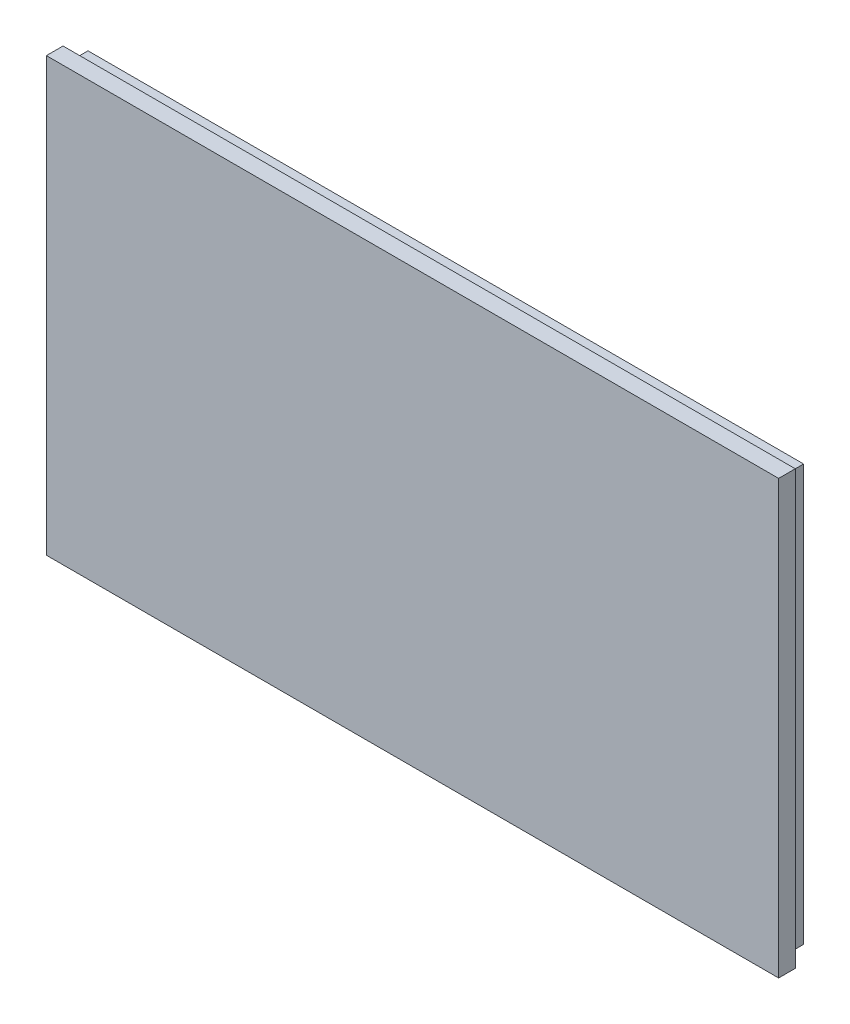
ISO-10303-21;
HEADER;
FILE_DESCRIPTION(('STEP AP214'),'2;1');
FILE_NAME('part.step','',(''),(''),'','','');
FILE_SCHEMA(('AUTOMOTIVE_DESIGN { 1 0 10303 214 1 1 1 1 }'));
ENDSEC;
DATA;
#1=APPLICATION_CONTEXT('core data for automotive mechanical design processes');
#2=APPLICATION_PROTOCOL_DEFINITION('international standard','automotive_design',2000,#1);
#3=PRODUCT_CONTEXT('',#1,'mechanical');
#4=PRODUCT('Part','Part','',(#3));
#5=PRODUCT_RELATED_PRODUCT_CATEGORY('part','',(#4));
#6=PRODUCT_DEFINITION_FORMATION('','',#4);
#7=PRODUCT_DEFINITION_CONTEXT('part definition',#1,'design');
#8=PRODUCT_DEFINITION('design','',#6,#7);
#9=PRODUCT_DEFINITION_SHAPE('','',#8);
#10=(LENGTH_UNIT() NAMED_UNIT(*) SI_UNIT(.MILLI.,.METRE.));
#11=(NAMED_UNIT(*) PLANE_ANGLE_UNIT() SI_UNIT($,.RADIAN.));
#12=(NAMED_UNIT(*) SI_UNIT($,.STERADIAN.) SOLID_ANGLE_UNIT());
#13=UNCERTAINTY_MEASURE_WITH_UNIT(LENGTH_MEASURE(1.E-05),#10,'distance_accuracy_value','');
#14=(GEOMETRIC_REPRESENTATION_CONTEXT(3) GLOBAL_UNCERTAINTY_ASSIGNED_CONTEXT((#13)) GLOBAL_UNIT_ASSIGNED_CONTEXT((#10,
#11,#12)) REPRESENTATION_CONTEXT('',''));
#15=CARTESIAN_POINT('',(0.,0.,0.));
#16=DIRECTION('',(0.,0.,1.));
#17=DIRECTION('',(1.,0.,0.));
#18=AXIS2_PLACEMENT_3D('',#15,#16,#17);
#19=CARTESIAN_POINT('',(22.,-13.,1.));
#20=DIRECTION('',(-1.,0.,0.));
#21=DIRECTION('',(0.,0.,1.));
#22=AXIS2_PLACEMENT_3D('',#19,#20,#21);
#23=PLANE('',#22);
#24=DIRECTION('',(0.,1.,0.));
#25=VECTOR('',#24,1.);
#26=CARTESIAN_POINT('',(22.,-13.,0.));
#27=LINE('',#26,#25);
#28=CARTESIAN_POINT('',(22.,-13.,0.));
#29=VERTEX_POINT('',#28);
#30=CARTESIAN_POINT('',(22.,13.,0.));
#31=VERTEX_POINT('',#30);
#32=EDGE_CURVE('E127',#29,#31,#27,.T.);
#33=ORIENTED_EDGE('',*,*,#32,.T.);
#34=DIRECTION('',(0.,0.,-1.));
#35=VECTOR('',#34,1.);
#36=CARTESIAN_POINT('',(22.,13.,1.));
#37=LINE('',#36,#35);
#38=CARTESIAN_POINT('',(22.,13.,1.));
#39=VERTEX_POINT('',#38);
#40=EDGE_CURVE('E11',#39,#31,#37,.T.);
#41=ORIENTED_EDGE('',*,*,#40,.F.);
#42=DIRECTION('',(0.,1.,0.));
#43=VECTOR('',#42,1.);
#44=CARTESIAN_POINT('',(22.,-13.,1.));
#45=LINE('',#44,#43);
#46=CARTESIAN_POINT('',(22.,-13.,1.));
#47=VERTEX_POINT('',#46);
#48=EDGE_CURVE('E138',#47,#39,#45,.T.);
#49=ORIENTED_EDGE('',*,*,#48,.F.);
#50=DIRECTION('',(0.,0.,-1.));
#51=VECTOR('',#50,1.);
#52=CARTESIAN_POINT('',(22.,-13.,1.));
#53=LINE('',#52,#51);
#54=EDGE_CURVE('E151',#47,#29,#53,.T.);
#55=ORIENTED_EDGE('',*,*,#54,.T.);
#56=EDGE_LOOP('',(#33,#41,#49,#55));
#57=FACE_BOUND('',#56,.T.);
#58=ADVANCED_FACE('F39',(#57),#23,.F.);
#59=CARTESIAN_POINT('',(-22.,13.,1.));
#60=DIRECTION('',(0.,-1.,0.));
#61=DIRECTION('',(0.,0.,-1.));
#62=AXIS2_PLACEMENT_3D('',#59,#60,#61);
#63=PLANE('',#62);
#64=DIRECTION('',(-1.,0.,0.));
#65=VECTOR('',#64,1.);
#66=CARTESIAN_POINT('',(-22.,13.,0.));
#67=LINE('',#66,#65);
#68=CARTESIAN_POINT('',(-22.,13.,0.));
#69=VERTEX_POINT('',#68);
#70=EDGE_CURVE('E132',#31,#69,#67,.T.);
#71=ORIENTED_EDGE('',*,*,#70,.T.);
#72=DIRECTION('',(0.,0.,-1.));
#73=VECTOR('',#72,1.);
#74=CARTESIAN_POINT('',(-22.,13.,1.));
#75=LINE('',#74,#73);
#76=CARTESIAN_POINT('',(-22.,13.,1.));
#77=VERTEX_POINT('',#76);
#78=EDGE_CURVE('E47',#77,#69,#75,.T.);
#79=ORIENTED_EDGE('',*,*,#78,.F.);
#80=DIRECTION('',(-1.,0.,0.));
#81=VECTOR('',#80,1.);
#82=CARTESIAN_POINT('',(-22.,13.,1.));
#83=LINE('',#82,#81);
#84=EDGE_CURVE('E142',#39,#77,#83,.T.);
#85=ORIENTED_EDGE('',*,*,#84,.F.);
#86=ORIENTED_EDGE('',*,*,#40,.T.);
#87=EDGE_LOOP('',(#71,#79,#85,#86));
#88=FACE_BOUND('',#87,.T.);
#89=ADVANCED_FACE('F188',(#88),#63,.F.);
#90=CARTESIAN_POINT('',(-22.,-13.,1.));
#91=DIRECTION('',(1.,0.,0.));
#92=DIRECTION('',(0.,0.,-1.));
#93=AXIS2_PLACEMENT_3D('',#90,#91,#92);
#94=PLANE('',#93);
#95=DIRECTION('',(0.,-1.,0.));
#96=VECTOR('',#95,1.);
#97=CARTESIAN_POINT('',(-22.,-13.,0.));
#98=LINE('',#97,#96);
#99=CARTESIAN_POINT('',(-22.,-13.,0.));
#100=VERTEX_POINT('',#99);
#101=EDGE_CURVE('E155',#69,#100,#98,.T.);
#102=ORIENTED_EDGE('',*,*,#101,.T.);
#103=DIRECTION('',(0.,0.,-1.));
#104=VECTOR('',#103,1.);
#105=CARTESIAN_POINT('',(-22.,-13.,1.));
#106=LINE('',#105,#104);
#107=CARTESIAN_POINT('',(-22.,-13.,1.));
#108=VERTEX_POINT('',#107);
#109=EDGE_CURVE('E163',#108,#100,#106,.T.);
#110=ORIENTED_EDGE('',*,*,#109,.F.);
#111=DIRECTION('',(0.,-1.,0.));
#112=VECTOR('',#111,1.);
#113=CARTESIAN_POINT('',(-22.,-13.,1.));
#114=LINE('',#113,#112);
#115=EDGE_CURVE('E146',#77,#108,#114,.T.);
#116=ORIENTED_EDGE('',*,*,#115,.F.);
#117=ORIENTED_EDGE('',*,*,#78,.T.);
#118=EDGE_LOOP('',(#102,#110,#116,#117));
#119=FACE_BOUND('',#118,.T.);
#120=ADVANCED_FACE('F172',(#119),#94,.F.);
#121=CARTESIAN_POINT('',(-22.,-13.,1.));
#122=DIRECTION('',(0.,1.,0.));
#123=DIRECTION('',(0.,0.,1.));
#124=AXIS2_PLACEMENT_3D('',#121,#122,#123);
#125=PLANE('',#124);
#126=DIRECTION('',(1.,0.,0.));
#127=VECTOR('',#126,1.);
#128=CARTESIAN_POINT('',(-22.,-13.,0.));
#129=LINE('',#128,#127);
#130=EDGE_CURVE('E143',#100,#29,#129,.T.);
#131=ORIENTED_EDGE('',*,*,#130,.T.);
#132=ORIENTED_EDGE('',*,*,#54,.F.);
#133=DIRECTION('',(1.,0.,0.));
#134=VECTOR('',#133,1.);
#135=CARTESIAN_POINT('',(-22.,-13.,1.));
#136=LINE('',#135,#134);
#137=EDGE_CURVE('E149',#108,#47,#136,.T.);
#138=ORIENTED_EDGE('',*,*,#137,.F.);
#139=ORIENTED_EDGE('',*,*,#109,.T.);
#140=EDGE_LOOP('',(#131,#132,#138,#139));
#141=FACE_BOUND('',#140,.T.);
#142=ADVANCED_FACE('F181',(#141),#125,.F.);
#143=CARTESIAN_POINT('',(0.,0.,1.));
#144=DIRECTION('',(0.,0.,-1.));
#145=DIRECTION('',(-1.,0.,0.));
#146=AXIS2_PLACEMENT_3D('',#143,#144,#145);
#147=PLANE('',#146);
#148=ORIENTED_EDGE('',*,*,#48,.T.);
#149=ORIENTED_EDGE('',*,*,#84,.T.);
#150=ORIENTED_EDGE('',*,*,#115,.T.);
#151=ORIENTED_EDGE('',*,*,#137,.T.);
#152=EDGE_LOOP('',(#148,#149,#150,#151));
#153=FACE_BOUND('',#152,.T.);
#154=ADVANCED_FACE('F187',(#153),#147,.F.);
#155=CARTESIAN_POINT('',(0.,0.,0.));
#156=DIRECTION('',(0.,0.,-1.));
#157=DIRECTION('',(-1.,0.,0.));
#158=AXIS2_PLACEMENT_3D('',#155,#156,#157);
#159=PLANE('',#158);
#160=DIRECTION('',(0.,1.,0.));
#161=VECTOR('',#160,1.);
#162=CARTESIAN_POINT('',(-21.5,-12.5,0.));
#163=LINE('',#162,#161);
#164=CARTESIAN_POINT('',(-21.5,-12.5,0.));
#165=VERTEX_POINT('',#164);
#166=CARTESIAN_POINT('',(-21.5,12.5,0.));
#167=VERTEX_POINT('',#166);
#168=EDGE_CURVE('E54',#165,#167,#163,.T.);
#169=ORIENTED_EDGE('',*,*,#168,.F.);
#170=DIRECTION('',(-1.,0.,0.));
#171=VECTOR('',#170,1.);
#172=CARTESIAN_POINT('',(21.5,-12.5,0.));
#173=LINE('',#172,#171);
#174=CARTESIAN_POINT('',(21.5,-12.5,0.));
#175=VERTEX_POINT('',#174);
#176=EDGE_CURVE('E58',#175,#165,#173,.T.);
#177=ORIENTED_EDGE('',*,*,#176,.F.);
#178=DIRECTION('',(0.,-1.,0.));
#179=VECTOR('',#178,1.);
#180=CARTESIAN_POINT('',(21.5,-12.5,0.));
#181=LINE('',#180,#179);
#182=CARTESIAN_POINT('',(21.5,12.5,0.));
#183=VERTEX_POINT('',#182);
#184=EDGE_CURVE('E283',#183,#175,#181,.T.);
#185=ORIENTED_EDGE('',*,*,#184,.F.);
#186=DIRECTION('',(1.,0.,0.));
#187=VECTOR('',#186,1.);
#188=CARTESIAN_POINT('',(21.5,12.5,0.));
#189=LINE('',#188,#187);
#190=EDGE_CURVE('E293',#167,#183,#189,.T.);
#191=ORIENTED_EDGE('',*,*,#190,.F.);
#192=EDGE_LOOP('',(#169,#177,#185,#191));
#193=FACE_BOUND('',#192,.T.);
#194=ORIENTED_EDGE('',*,*,#32,.F.);
#195=ORIENTED_EDGE('',*,*,#130,.F.);
#196=ORIENTED_EDGE('',*,*,#101,.F.);
#197=ORIENTED_EDGE('',*,*,#70,.F.);
#198=EDGE_LOOP('',(#194,#195,#196,#197));
#199=FACE_BOUND('',#198,.T.);
#200=ADVANCED_FACE('F178',(#193,#199),#159,.T.);
#201=CARTESIAN_POINT('',(-21.5,-12.5,-1.));
#202=DIRECTION('',(1.,0.,0.));
#203=DIRECTION('',(0.,0.,-1.));
#204=AXIS2_PLACEMENT_3D('',#201,#202,#203);
#205=PLANE('',#204);
#206=ORIENTED_EDGE('',*,*,#168,.T.);
#207=DIRECTION('',(0.,0.,1.));
#208=VECTOR('',#207,1.);
#209=CARTESIAN_POINT('',(-21.5,12.5,-1.));
#210=LINE('',#209,#208);
#211=CARTESIAN_POINT('',(-21.5,12.5,-1.));
#212=VERTEX_POINT('',#211);
#213=EDGE_CURVE('E107',#212,#167,#210,.T.);
#214=ORIENTED_EDGE('',*,*,#213,.F.);
#215=DIRECTION('',(0.,1.,0.));
#216=VECTOR('',#215,1.);
#217=CARTESIAN_POINT('',(-21.5,-12.5,-1.));
#218=LINE('',#217,#216);
#219=CARTESIAN_POINT('',(-21.5,-12.5,-1.));
#220=VERTEX_POINT('',#219);
#221=EDGE_CURVE('E114',#220,#212,#218,.T.);
#222=ORIENTED_EDGE('',*,*,#221,.F.);
#223=DIRECTION('',(0.,0.,1.));
#224=VECTOR('',#223,1.);
#225=CARTESIAN_POINT('',(-21.5,-12.5,-1.));
#226=LINE('',#225,#224);
#227=EDGE_CURVE('E280',#220,#165,#226,.T.);
#228=ORIENTED_EDGE('',*,*,#227,.T.);
#229=EDGE_LOOP('',(#206,#214,#222,#228));
#230=FACE_BOUND('',#229,.T.);
#231=ADVANCED_FACE('F125',(#230),#205,.F.);
#232=CARTESIAN_POINT('',(21.5,12.5,-1.));
#233=DIRECTION('',(0.,-1.,0.));
#234=DIRECTION('',(0.,0.,-1.));
#235=AXIS2_PLACEMENT_3D('',#232,#233,#234);
#236=PLANE('',#235);
#237=ORIENTED_EDGE('',*,*,#190,.T.);
#238=DIRECTION('',(0.,0.,1.));
#239=VECTOR('',#238,1.);
#240=CARTESIAN_POINT('',(21.5,12.5,-1.));
#241=LINE('',#240,#239);
#242=CARTESIAN_POINT('',(21.5,12.5,-1.));
#243=VERTEX_POINT('',#242);
#244=EDGE_CURVE('E109',#243,#183,#241,.T.);
#245=ORIENTED_EDGE('',*,*,#244,.F.);
#246=DIRECTION('',(1.,0.,0.));
#247=VECTOR('',#246,1.);
#248=CARTESIAN_POINT('',(21.5,12.5,-1.));
#249=LINE('',#248,#247);
#250=EDGE_CURVE('E102',#212,#243,#249,.T.);
#251=ORIENTED_EDGE('',*,*,#250,.F.);
#252=ORIENTED_EDGE('',*,*,#213,.T.);
#253=EDGE_LOOP('',(#237,#245,#251,#252));
#254=FACE_BOUND('',#253,.T.);
#255=ADVANCED_FACE('F105',(#254),#236,.F.);
#256=CARTESIAN_POINT('',(21.5,-12.5,-1.));
#257=DIRECTION('',(-1.,0.,0.));
#258=DIRECTION('',(0.,0.,1.));
#259=AXIS2_PLACEMENT_3D('',#256,#257,#258);
#260=PLANE('',#259);
#261=ORIENTED_EDGE('',*,*,#184,.T.);
#262=DIRECTION('',(0.,0.,1.));
#263=VECTOR('',#262,1.);
#264=CARTESIAN_POINT('',(21.5,-12.5,-1.));
#265=LINE('',#264,#263);
#266=CARTESIAN_POINT('',(21.5,-12.5,-1.));
#267=VERTEX_POINT('',#266);
#268=EDGE_CURVE('E134',#267,#175,#265,.T.);
#269=ORIENTED_EDGE('',*,*,#268,.F.);
#270=DIRECTION('',(0.,-1.,0.));
#271=VECTOR('',#270,1.);
#272=CARTESIAN_POINT('',(21.5,-12.5,-1.));
#273=LINE('',#272,#271);
#274=EDGE_CURVE('E113',#243,#267,#273,.T.);
#275=ORIENTED_EDGE('',*,*,#274,.F.);
#276=ORIENTED_EDGE('',*,*,#244,.T.);
#277=EDGE_LOOP('',(#261,#269,#275,#276));
#278=FACE_BOUND('',#277,.T.);
#279=ADVANCED_FACE('F206',(#278),#260,.F.);
#280=CARTESIAN_POINT('',(21.5,-12.5,-1.));
#281=DIRECTION('',(0.,1.,0.));
#282=DIRECTION('',(0.,0.,1.));
#283=AXIS2_PLACEMENT_3D('',#280,#281,#282);
#284=PLANE('',#283);
#285=ORIENTED_EDGE('',*,*,#176,.T.);
#286=ORIENTED_EDGE('',*,*,#227,.F.);
#287=DIRECTION('',(-1.,0.,0.));
#288=VECTOR('',#287,1.);
#289=CARTESIAN_POINT('',(21.5,-12.5,-1.));
#290=LINE('',#289,#288);
#291=EDGE_CURVE('E119',#267,#220,#290,.T.);
#292=ORIENTED_EDGE('',*,*,#291,.F.);
#293=ORIENTED_EDGE('',*,*,#268,.T.);
#294=EDGE_LOOP('',(#285,#286,#292,#293));
#295=FACE_BOUND('',#294,.T.);
#296=ADVANCED_FACE('F209',(#295),#284,.F.);
#297=CARTESIAN_POINT('',(0.,0.,-1.));
#298=DIRECTION('',(0.,0.,1.));
#299=DIRECTION('',(1.,0.,0.));
#300=AXIS2_PLACEMENT_3D('',#297,#298,#299);
#301=PLANE('',#300);
#302=ORIENTED_EDGE('',*,*,#221,.T.);
#303=ORIENTED_EDGE('',*,*,#250,.T.);
#304=ORIENTED_EDGE('',*,*,#274,.T.);
#305=ORIENTED_EDGE('',*,*,#291,.T.);
#306=EDGE_LOOP('',(#302,#303,#304,#305));
#307=FACE_BOUND('',#306,.T.);
#308=ADVANCED_FACE('F117',(#307),#301,.F.);
#309=CLOSED_SHELL('',(#58,#89,#120,#142,#154,#200,#231,#255,#279,#296,#308));
#310=MANIFOLD_SOLID_BREP('B2',#309);
#311=ADVANCED_BREP_SHAPE_REPRESENTATION('',(#18,#310),#14);
#312=SHAPE_DEFINITION_REPRESENTATION(#9,#311);
ENDSEC;
END-ISO-10303-21;
